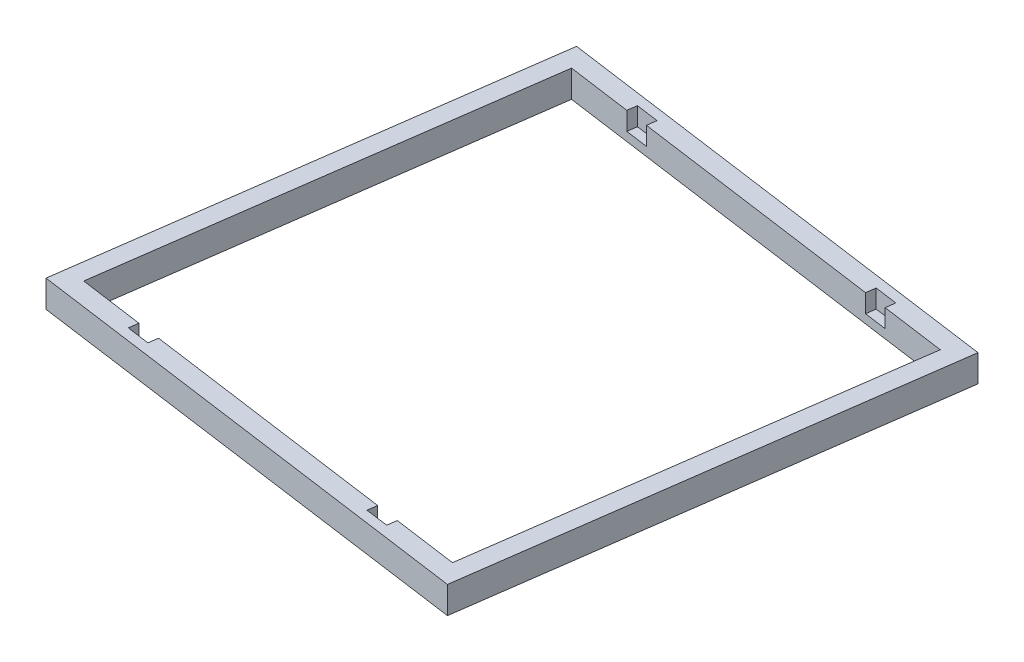
ISO-10303-21;
HEADER;
FILE_DESCRIPTION(('STEP AP214'),'2;1');
FILE_NAME('part.step','',(''),(''),'','','');
FILE_SCHEMA(('AUTOMOTIVE_DESIGN { 1 0 10303 214 1 1 1 1 }'));
ENDSEC;
DATA;
#1=APPLICATION_CONTEXT('core data for automotive mechanical design processes');
#2=APPLICATION_PROTOCOL_DEFINITION('international standard','automotive_design',2000,#1);
#3=PRODUCT_CONTEXT('',#1,'mechanical');
#4=PRODUCT('Part','Part','',(#3));
#5=PRODUCT_RELATED_PRODUCT_CATEGORY('part','',(#4));
#6=PRODUCT_DEFINITION_FORMATION('','',#4);
#7=PRODUCT_DEFINITION_CONTEXT('part definition',#1,'design');
#8=PRODUCT_DEFINITION('design','',#6,#7);
#9=PRODUCT_DEFINITION_SHAPE('','',#8);
#10=(LENGTH_UNIT() NAMED_UNIT(*) SI_UNIT(.MILLI.,.METRE.));
#11=(NAMED_UNIT(*) PLANE_ANGLE_UNIT() SI_UNIT($,.RADIAN.));
#12=(NAMED_UNIT(*) SI_UNIT($,.STERADIAN.) SOLID_ANGLE_UNIT());
#13=UNCERTAINTY_MEASURE_WITH_UNIT(LENGTH_MEASURE(1.E-05),#10,'distance_accuracy_value','');
#14=(GEOMETRIC_REPRESENTATION_CONTEXT(3) GLOBAL_UNCERTAINTY_ASSIGNED_CONTEXT((#13)) GLOBAL_UNIT_ASSIGNED_CONTEXT((#10,
#11,#12)) REPRESENTATION_CONTEXT('',''));
#15=CARTESIAN_POINT('',(0.,0.,0.));
#16=DIRECTION('',(0.,0.,1.));
#17=DIRECTION('',(1.,0.,0.));
#18=AXIS2_PLACEMENT_3D('',#15,#16,#17);
#19=CARTESIAN_POINT('',(0.,5.08,0.));
#20=DIRECTION('',(0.,1.,0.));
#21=DIRECTION('',(0.,0.,1.));
#22=AXIS2_PLACEMENT_3D('',#19,#20,#21);
#23=PLANE('',#22);
#24=DIRECTION('',(0.137667557047881,0.,-0.990478492313926));
#25=VECTOR('',#24,1.);
#26=CARTESIAN_POINT('',(-92.7077964020911,5.08,-12.8855456721246));
#27=LINE('',#26,#25);
#28=CARTESIAN_POINT('',(-96.340320285637,5.08,13.2494192871031));
#29=VERTEX_POINT('',#28);
#30=CARTESIAN_POINT('',(-96.0955473692058,5.08,11.4883485277689));
#31=VERTEX_POINT('',#30);
#32=EDGE_CURVE('E224',#29,#31,#27,.T.);
#33=ORIENTED_EDGE('',*,*,#32,.F.);
#34=DIRECTION('',(-0.990478492313926,0.,-0.137667557047881));
#35=VECTOR('',#34,1.);
#36=CARTESIAN_POINT('',(-3.63252388354589,5.08,26.1349649592277));
#37=LINE('',#36,#35);
#38=CARTESIAN_POINT('',(-100.617206415449,5.08,12.6549707757703));
#39=VERTEX_POINT('',#38);
#40=EDGE_CURVE('E11',#29,#39,#37,.T.);
#41=ORIENTED_EDGE('',*,*,#40,.T.);
#42=DIRECTION('',(-0.137667557047881,0.,0.990478492313926));
#43=VECTOR('',#42,1.);
#44=CARTESIAN_POINT('',(-96.9846825319028,5.08,-13.4799941834574));
#45=LINE('',#44,#43);
#46=CARTESIAN_POINT('',(-100.372433499018,5.08,10.8939000164362));
#47=VERTEX_POINT('',#46);
#48=EDGE_CURVE('E221',#47,#39,#45,.T.);
#49=ORIENTED_EDGE('',*,*,#48,.F.);
#50=DIRECTION('',(0.990478492313926,0.,0.137667557047881));
#51=VECTOR('',#50,1.);
#52=CARTESIAN_POINT('',(-112.425108514948,5.08,9.21868713881081));
#53=LINE('',#52,#51);
#54=CARTESIAN_POINT('',(-112.425108514948,5.08,9.21868713881082));
#55=VERTEX_POINT('',#54);
#56=EDGE_CURVE('E304',#55,#47,#53,.T.);
#57=ORIENTED_EDGE('',*,*,#56,.F.);
#58=DIRECTION('',(-0.137667557047881,0.,0.990478492313926));
#59=VECTOR('',#58,1.);
#60=CARTESIAN_POINT('',(-101.244917101907,5.08,-71.2195756736735));
#61=LINE('',#60,#59);
#62=CARTESIAN_POINT('',(-101.244917101907,5.08,-71.2195756736735));
#63=VERTEX_POINT('',#62);
#64=EDGE_CURVE('E299',#63,#55,#61,.T.);
#65=ORIENTED_EDGE('',*,*,#64,.F.);
#66=DIRECTION('',(-0.990478492313926,0.,-0.137667557047882));
#67=VECTOR('',#66,1.);
#68=CARTESIAN_POINT('',(-20.8066542894228,5.08,-60.0393842606323));
#69=LINE('',#68,#67);
#70=CARTESIAN_POINT('',(-89.1922420859762,5.08,-69.5443627960482));
#71=VERTEX_POINT('',#70);
#72=EDGE_CURVE('E294',#71,#63,#69,.T.);
#73=ORIENTED_EDGE('',*,*,#72,.F.);
#74=DIRECTION('',(-0.137667557047882,0.,0.990478492313926));
#75=VECTOR('',#74,1.);
#76=CARTESIAN_POINT('',(-96.9846825319027,5.08,-13.4799941834574));
#77=LINE('',#76,#75);
#78=CARTESIAN_POINT('',(-88.9474691695451,5.08,-71.3054335553824));
#79=VERTEX_POINT('',#78);
#80=EDGE_CURVE('E58',#79,#71,#77,.T.);
#81=ORIENTED_EDGE('',*,*,#80,.F.);
#82=DIRECTION('',(0.990478492313926,0.,0.137667557047881));
#83=VECTOR('',#82,1.);
#84=CARTESIAN_POINT('',(8.03721336235755,5.08,-57.825439371925));
#85=LINE('',#84,#83);
#86=CARTESIAN_POINT('',(-84.6705830397335,5.08,-70.7109850440496));
#87=VERTEX_POINT('',#86);
#88=EDGE_CURVE('E371',#79,#87,#85,.T.);
#89=ORIENTED_EDGE('',*,*,#88,.T.);
#90=DIRECTION('',(0.137667557047882,0.,-0.990478492313926));
#91=VECTOR('',#90,1.);
#92=CARTESIAN_POINT('',(-92.7077964020911,5.08,-12.8855456721247));
#93=LINE('',#92,#91);
#94=CARTESIAN_POINT('',(-84.9153559561647,5.08,-68.9499142847154));
#95=VERTEX_POINT('',#94);
#96=EDGE_CURVE('E245',#95,#87,#93,.T.);
#97=ORIENTED_EDGE('',*,*,#96,.F.);
#98=CARTESIAN_POINT('',(-37.1148639170946,5.08,-62.3060779815847));
#99=VERTEX_POINT('',#98);
#100=EDGE_CURVE('E300',#99,#95,#69,.T.);
#101=ORIENTED_EDGE('',*,*,#100,.F.);
#102=DIRECTION('',(-0.137667557047882,0.,0.990478492313926));
#103=VECTOR('',#102,1.);
#104=CARTESIAN_POINT('',(-44.9073043630211,5.08,-6.24170936899391));
#105=LINE('',#104,#103);
#106=CARTESIAN_POINT('',(-36.8700910006635,5.08,-64.0671487409188));
#107=VERTEX_POINT('',#106);
#108=EDGE_CURVE('E263',#107,#99,#105,.T.);
#109=ORIENTED_EDGE('',*,*,#108,.F.);
#110=DIRECTION('',(0.990478492313926,0.,0.137667557047881));
#111=VECTOR('',#110,1.);
#112=CARTESIAN_POINT('',(8.03721336235759,5.08,-57.8254393719249));
#113=LINE('',#112,#111);
#114=CARTESIAN_POINT('',(-32.5932048708519,5.08,-63.4727002295861));
#115=VERTEX_POINT('',#114);
#116=EDGE_CURVE('E366',#107,#115,#113,.T.);
#117=ORIENTED_EDGE('',*,*,#116,.T.);
#118=DIRECTION('',(0.137667557047882,0.,-0.990478492313926));
#119=VECTOR('',#118,1.);
#120=CARTESIAN_POINT('',(-40.6304182332096,5.08,-5.64726085766115));
#121=LINE('',#120,#119);
#122=CARTESIAN_POINT('',(-32.8379777872831,5.08,-61.7116294702519));
#123=VERTEX_POINT('',#122);
#124=EDGE_CURVE('E267',#123,#115,#121,.T.);
#125=ORIENTED_EDGE('',*,*,#124,.F.);
#126=CARTESIAN_POINT('',(-20.8066542894228,5.08,-60.0393842606323));
#127=VERTEX_POINT('',#126);
#128=EDGE_CURVE('E296',#127,#123,#69,.T.);
#129=ORIENTED_EDGE('',*,*,#128,.F.);
#130=DIRECTION('',(0.137667557047881,0.,-0.990478492313926));
#131=VECTOR('',#130,1.);
#132=CARTESIAN_POINT('',(-31.986845702464,5.08,20.398878551852));
#133=LINE('',#132,#131);
#134=CARTESIAN_POINT('',(-31.986845702464,5.08,20.398878551852));
#135=VERTEX_POINT('',#134);
#136=EDGE_CURVE('E292',#135,#127,#133,.T.);
#137=ORIENTED_EDGE('',*,*,#136,.F.);
#138=CARTESIAN_POINT('',(-44.0181692003243,5.08,18.7266333422324));
#139=VERTEX_POINT('',#138);
#140=EDGE_CURVE('E303',#139,#135,#53,.T.);
#141=ORIENTED_EDGE('',*,*,#140,.F.);
#142=DIRECTION('',(0.137667557047881,0.,-0.990478492313926));
#143=VECTOR('',#142,1.);
#144=CARTESIAN_POINT('',(-40.6304182332096,5.08,-5.64726085766114));
#145=LINE('',#144,#143);
#146=CARTESIAN_POINT('',(-44.2629421167555,5.08,20.4877041015666));
#147=VERTEX_POINT('',#146);
#148=EDGE_CURVE('E289',#147,#139,#145,.T.);
#149=ORIENTED_EDGE('',*,*,#148,.F.);
#150=DIRECTION('',(-0.990478492313926,0.,-0.137667557047881));
#151=VECTOR('',#150,1.);
#152=CARTESIAN_POINT('',(-3.63252388354589,5.08,26.1349649592277));
#153=LINE('',#152,#151);
#154=CARTESIAN_POINT('',(-48.539828246567,5.08,19.8932555902338));
#155=VERTEX_POINT('',#154);
#156=EDGE_CURVE('E361',#147,#155,#153,.T.);
#157=ORIENTED_EDGE('',*,*,#156,.T.);
#158=DIRECTION('',(-0.137667557047881,0.,0.990478492313926));
#159=VECTOR('',#158,1.);
#160=CARTESIAN_POINT('',(-44.9073043630211,5.08,-6.24170936899389));
#161=LINE('',#160,#159);
#162=CARTESIAN_POINT('',(-48.2950553301359,5.08,18.1321848308997));
#163=VERTEX_POINT('',#162);
#164=EDGE_CURVE('E286',#163,#155,#161,.T.);
#165=ORIENTED_EDGE('',*,*,#164,.F.);
#166=EDGE_CURVE('E308',#31,#163,#53,.T.);
#167=ORIENTED_EDGE('',*,*,#166,.F.);
#168=EDGE_LOOP('',(#33,#41,#49,#57,#65,#73,#81,#89,#97,#101,#109,#117,#125,#129,#137,#141,#149,
#157,#165,#167));
#169=FACE_BOUND('',#168,.T.);
#170=DIRECTION('',(0.990538086436754,0.,0.137238111755494));
#171=VECTOR('',#170,1.);
#172=CARTESIAN_POINT('',(-116.440036471431,5.08,12.2876896910503));
#173=LINE('',#172,#171);
#174=CARTESIAN_POINT('',(-116.440036471431,5.08,12.2876896910503));
#175=VERTEX_POINT('',#174);
#176=CARTESIAN_POINT('',(-28.9178431502251,5.08,24.4138065083348));
#177=VERTEX_POINT('',#176);
#178=EDGE_CURVE('E329',#175,#177,#173,.T.);
#179=ORIENTED_EDGE('',*,*,#178,.T.);
#180=DIRECTION('',(0.137238111755497,0.,-0.990538086436754));
#181=VECTOR('',#180,1.);
#182=CARTESIAN_POINT('',(-28.9178431502251,5.08,24.4138065083348));
#183=LINE('',#182,#181);
#184=CARTESIAN_POINT('',(-16.7917263329401,5.08,-63.1083868128714));
#185=VERTEX_POINT('',#184);
#186=EDGE_CURVE('E332',#177,#185,#183,.T.);
#187=ORIENTED_EDGE('',*,*,#186,.T.);
#188=DIRECTION('',(-0.990538086436754,0.,-0.137238111755494));
#189=VECTOR('',#188,1.);
#190=CARTESIAN_POINT('',(-16.7917263329401,5.08,-63.1083868128714));
#191=LINE('',#190,#189);
#192=CARTESIAN_POINT('',(-104.313919654146,5.08,-75.234503630156));
#193=VERTEX_POINT('',#192);
#194=EDGE_CURVE('E335',#185,#193,#191,.T.);
#195=ORIENTED_EDGE('',*,*,#194,.T.);
#196=DIRECTION('',(-0.137238111755494,0.,0.990538086436754));
#197=VECTOR('',#196,1.);
#198=CARTESIAN_POINT('',(-104.313919654146,5.08,-75.234503630156));
#199=LINE('',#198,#197);
#200=EDGE_CURVE('E337',#193,#175,#199,.T.);
#201=ORIENTED_EDGE('',*,*,#200,.T.);
#202=EDGE_LOOP('',(#179,#187,#195,#201));
#203=FACE_BOUND('',#202,.T.);
#204=ADVANCED_FACE('F35',(#169,#203),#23,.T.);
#205=CARTESIAN_POINT('',(0.,0.,0.));
#206=DIRECTION('',(0.,1.,0.));
#207=DIRECTION('',(0.,0.,1.));
#208=AXIS2_PLACEMENT_3D('',#205,#206,#207);
#209=PLANE('',#208);
#210=DIRECTION('',(0.990538086436754,0.,0.137238111755494));
#211=VECTOR('',#210,1.);
#212=CARTESIAN_POINT('',(-116.440036471431,0.,12.2876896910503));
#213=LINE('',#212,#211);
#214=CARTESIAN_POINT('',(-116.440036471431,0.,12.2876896910503));
#215=VERTEX_POINT('',#214);
#216=CARTESIAN_POINT('',(-28.9178431502251,0.,24.4138065083348));
#217=VERTEX_POINT('',#216);
#218=EDGE_CURVE('E328',#215,#217,#213,.T.);
#219=ORIENTED_EDGE('',*,*,#218,.F.);
#220=DIRECTION('',(-0.137238111755494,0.,0.990538086436754));
#221=VECTOR('',#220,1.);
#222=CARTESIAN_POINT('',(-104.313919654146,0.,-75.234503630156));
#223=LINE('',#222,#221);
#224=CARTESIAN_POINT('',(-104.313919654146,0.,-75.234503630156));
#225=VERTEX_POINT('',#224);
#226=EDGE_CURVE('E333',#225,#215,#223,.T.);
#227=ORIENTED_EDGE('',*,*,#226,.F.);
#228=DIRECTION('',(-0.990538086436754,0.,-0.137238111755494));
#229=VECTOR('',#228,1.);
#230=CARTESIAN_POINT('',(-16.7917263329401,0.,-63.1083868128714));
#231=LINE('',#230,#229);
#232=CARTESIAN_POINT('',(-16.7917263329401,0.,-63.1083868128714));
#233=VERTEX_POINT('',#232);
#234=EDGE_CURVE('E344',#233,#225,#231,.T.);
#235=ORIENTED_EDGE('',*,*,#234,.F.);
#236=DIRECTION('',(0.137238111755497,0.,-0.990538086436754));
#237=VECTOR('',#236,1.);
#238=CARTESIAN_POINT('',(-28.9178431502251,0.,24.4138065083348));
#239=LINE('',#238,#237);
#240=EDGE_CURVE('E342',#217,#233,#239,.T.);
#241=ORIENTED_EDGE('',*,*,#240,.F.);
#242=EDGE_LOOP('',(#219,#227,#235,#241));
#243=FACE_BOUND('',#242,.T.);
#244=DIRECTION('',(0.137667557047881,0.,-0.990478492313926));
#245=VECTOR('',#244,1.);
#246=CARTESIAN_POINT('',(-31.986845702464,0.,20.398878551852));
#247=LINE('',#246,#245);
#248=CARTESIAN_POINT('',(-31.986845702464,0.,20.398878551852));
#249=VERTEX_POINT('',#248);
#250=CARTESIAN_POINT('',(-20.8066542894228,0.,-60.0393842606323));
#251=VERTEX_POINT('',#250);
#252=EDGE_CURVE('E291',#249,#251,#247,.T.);
#253=ORIENTED_EDGE('',*,*,#252,.T.);
#254=DIRECTION('',(-0.990478492313926,0.,-0.137667557047882));
#255=VECTOR('',#254,1.);
#256=CARTESIAN_POINT('',(-20.8066542894228,0.,-60.0393842606323));
#257=LINE('',#256,#255);
#258=CARTESIAN_POINT('',(-101.244917101907,0.,-71.2195756736735));
#259=VERTEX_POINT('',#258);
#260=EDGE_CURVE('E311',#251,#259,#257,.T.);
#261=ORIENTED_EDGE('',*,*,#260,.T.);
#262=DIRECTION('',(-0.137667557047881,0.,0.990478492313926));
#263=VECTOR('',#262,1.);
#264=CARTESIAN_POINT('',(-101.244917101907,0.,-71.2195756736735));
#265=LINE('',#264,#263);
#266=CARTESIAN_POINT('',(-112.425108514948,0.,9.21868713881081));
#267=VERTEX_POINT('',#266);
#268=EDGE_CURVE('E314',#259,#267,#265,.T.);
#269=ORIENTED_EDGE('',*,*,#268,.T.);
#270=DIRECTION('',(0.990478492313926,0.,0.137667557047881));
#271=VECTOR('',#270,1.);
#272=CARTESIAN_POINT('',(-112.425108514948,0.,9.21868713881081));
#273=LINE('',#272,#271);
#274=EDGE_CURVE('E295',#267,#249,#273,.T.);
#275=ORIENTED_EDGE('',*,*,#274,.T.);
#276=EDGE_LOOP('',(#253,#261,#269,#275));
#277=FACE_BOUND('',#276,.T.);
#278=ADVANCED_FACE('F409',(#243,#277),#209,.F.);
#279=CARTESIAN_POINT('',(-116.440036471431,5.08,12.2876896910503));
#280=DIRECTION('',(0.137238111755494,0.,-0.990538086436754));
#281=DIRECTION('',(-0.990538086436754,0.,-0.137238111755494));
#282=AXIS2_PLACEMENT_3D('',#279,#280,#281);
#283=PLANE('',#282);
#284=ORIENTED_EDGE('',*,*,#218,.T.);
#285=DIRECTION('',(0.,-1.,0.));
#286=VECTOR('',#285,1.);
#287=CARTESIAN_POINT('',(-28.9178431502251,5.08,24.4138065083348));
#288=LINE('',#287,#286);
#289=EDGE_CURVE('E355',#177,#217,#288,.T.);
#290=ORIENTED_EDGE('',*,*,#289,.F.);
#291=ORIENTED_EDGE('',*,*,#178,.F.);
#292=DIRECTION('',(0.,-1.,0.));
#293=VECTOR('',#292,1.);
#294=CARTESIAN_POINT('',(-116.440036471431,5.08,12.2876896910503));
#295=LINE('',#294,#293);
#296=EDGE_CURVE('E339',#175,#215,#295,.T.);
#297=ORIENTED_EDGE('',*,*,#296,.T.);
#298=EDGE_LOOP('',(#284,#290,#291,#297));
#299=FACE_BOUND('',#298,.T.);
#300=ADVANCED_FACE('F37',(#299),#283,.F.);
#301=CARTESIAN_POINT('',(-28.9178431502251,5.08,24.4138065083348));
#302=DIRECTION('',(-0.990538086436754,0.,-0.137238111755497));
#303=DIRECTION('',(-0.137238111755497,0.,0.990538086436754));
#304=AXIS2_PLACEMENT_3D('',#301,#302,#303);
#305=PLANE('',#304);
#306=ORIENTED_EDGE('',*,*,#240,.T.);
#307=DIRECTION('',(0.,-1.,0.));
#308=VECTOR('',#307,1.);
#309=CARTESIAN_POINT('',(-16.7917263329401,5.08,-63.1083868128714));
#310=LINE('',#309,#308);
#311=EDGE_CURVE('E352',#185,#233,#310,.T.);
#312=ORIENTED_EDGE('',*,*,#311,.F.);
#313=ORIENTED_EDGE('',*,*,#186,.F.);
#314=ORIENTED_EDGE('',*,*,#289,.T.);
#315=EDGE_LOOP('',(#306,#312,#313,#314));
#316=FACE_BOUND('',#315,.T.);
#317=ADVANCED_FACE('F456',(#316),#305,.F.);
#318=CARTESIAN_POINT('',(-16.7917263329401,5.08,-63.1083868128714));
#319=DIRECTION('',(-0.137238111755494,0.,0.990538086436754));
#320=DIRECTION('',(0.990538086436754,0.,0.137238111755494));
#321=AXIS2_PLACEMENT_3D('',#318,#319,#320);
#322=PLANE('',#321);
#323=ORIENTED_EDGE('',*,*,#234,.T.);
#324=DIRECTION('',(0.,-1.,0.));
#325=VECTOR('',#324,1.);
#326=CARTESIAN_POINT('',(-104.313919654146,5.08,-75.234503630156));
#327=LINE('',#326,#325);
#328=EDGE_CURVE('E349',#193,#225,#327,.T.);
#329=ORIENTED_EDGE('',*,*,#328,.F.);
#330=ORIENTED_EDGE('',*,*,#194,.F.);
#331=ORIENTED_EDGE('',*,*,#311,.T.);
#332=EDGE_LOOP('',(#323,#329,#330,#331));
#333=FACE_BOUND('',#332,.T.);
#334=ADVANCED_FACE('F453',(#333),#322,.F.);
#335=CARTESIAN_POINT('',(-104.313919654146,5.08,-75.234503630156));
#336=DIRECTION('',(0.990538086436754,0.,0.137238111755494));
#337=DIRECTION('',(0.137238111755494,0.,-0.990538086436754));
#338=AXIS2_PLACEMENT_3D('',#335,#336,#337);
#339=PLANE('',#338);
#340=ORIENTED_EDGE('',*,*,#226,.T.);
#341=ORIENTED_EDGE('',*,*,#296,.F.);
#342=ORIENTED_EDGE('',*,*,#200,.F.);
#343=ORIENTED_EDGE('',*,*,#328,.T.);
#344=EDGE_LOOP('',(#340,#341,#342,#343));
#345=FACE_BOUND('',#344,.T.);
#346=ADVANCED_FACE('F450',(#345),#339,.F.);
#347=CARTESIAN_POINT('',(-31.986845702464,5.08,20.398878551852));
#348=DIRECTION('',(-0.990478492313926,0.,-0.137667557047881));
#349=DIRECTION('',(-0.137667557047881,0.,0.990478492313926));
#350=AXIS2_PLACEMENT_3D('',#347,#348,#349);
#351=PLANE('',#350);
#352=ORIENTED_EDGE('',*,*,#252,.F.);
#353=DIRECTION('',(0.,-1.,0.));
#354=VECTOR('',#353,1.);
#355=CARTESIAN_POINT('',(-31.986845702464,5.08,20.398878551852));
#356=LINE('',#355,#354);
#357=EDGE_CURVE('E307',#135,#249,#356,.T.);
#358=ORIENTED_EDGE('',*,*,#357,.F.);
#359=ORIENTED_EDGE('',*,*,#136,.T.);
#360=DIRECTION('',(0.,-1.,0.));
#361=VECTOR('',#360,1.);
#362=CARTESIAN_POINT('',(-20.8066542894228,5.08,-60.0393842606323));
#363=LINE('',#362,#361);
#364=EDGE_CURVE('E325',#127,#251,#363,.T.);
#365=ORIENTED_EDGE('',*,*,#364,.T.);
#366=EDGE_LOOP('',(#352,#358,#359,#365));
#367=FACE_BOUND('',#366,.T.);
#368=ADVANCED_FACE('F413',(#367),#351,.T.);
#369=CARTESIAN_POINT('',(-20.8066542894228,5.08,-60.0393842606323));
#370=DIRECTION('',(-0.137667557047882,0.,0.990478492313926));
#371=DIRECTION('',(0.990478492313926,0.,0.137667557047882));
#372=AXIS2_PLACEMENT_3D('',#369,#370,#371);
#373=PLANE('',#372);
#374=DIRECTION('',(0.,1.,0.));
#375=VECTOR('',#374,1.);
#376=CARTESIAN_POINT('',(-84.9153559561647,1.651,-68.9499142847154));
#377=LINE('',#376,#375);
#378=CARTESIAN_POINT('',(-84.9153559561647,1.651,-68.9499142847154));
#379=VERTEX_POINT('',#378);
#380=EDGE_CURVE('E226',#379,#95,#377,.T.);
#381=ORIENTED_EDGE('',*,*,#380,.F.);
#382=DIRECTION('',(0.990478492313926,0.,0.137667557047881));
#383=VECTOR('',#382,1.);
#384=CARTESIAN_POINT('',(-89.1922420859762,1.651,-69.5443627960482));
#385=LINE('',#384,#383);
#386=CARTESIAN_POINT('',(-89.1922420859762,1.651,-69.5443627960482));
#387=VERTEX_POINT('',#386);
#388=EDGE_CURVE('E231',#387,#379,#385,.T.);
#389=ORIENTED_EDGE('',*,*,#388,.F.);
#390=DIRECTION('',(0.,-1.,0.));
#391=VECTOR('',#390,1.);
#392=CARTESIAN_POINT('',(-89.1922420859763,5.08,-69.5443627960482));
#393=LINE('',#392,#391);
#394=EDGE_CURVE('E369',#71,#387,#393,.T.);
#395=ORIENTED_EDGE('',*,*,#394,.F.);
#396=ORIENTED_EDGE('',*,*,#72,.T.);
#397=DIRECTION('',(0.,-1.,0.));
#398=VECTOR('',#397,1.);
#399=CARTESIAN_POINT('',(-101.244917101907,5.08,-71.2195756736735));
#400=LINE('',#399,#398);
#401=EDGE_CURVE('E323',#63,#259,#400,.T.);
#402=ORIENTED_EDGE('',*,*,#401,.T.);
#403=ORIENTED_EDGE('',*,*,#260,.F.);
#404=ORIENTED_EDGE('',*,*,#364,.F.);
#405=ORIENTED_EDGE('',*,*,#128,.T.);
#406=DIRECTION('',(0.,1.,0.));
#407=VECTOR('',#406,1.);
#408=CARTESIAN_POINT('',(-32.8379777872831,1.651,-61.7116294702519));
#409=LINE('',#408,#407);
#410=CARTESIAN_POINT('',(-32.8379777872831,1.651,-61.7116294702519));
#411=VERTEX_POINT('',#410);
#412=EDGE_CURVE('E247',#411,#123,#409,.T.);
#413=ORIENTED_EDGE('',*,*,#412,.F.);
#414=DIRECTION('',(0.990478492313926,0.,0.137667557047881));
#415=VECTOR('',#414,1.);
#416=CARTESIAN_POINT('',(-37.1148639170946,1.651,-62.3060779815847));
#417=LINE('',#416,#415);
#418=CARTESIAN_POINT('',(-37.1148639170946,1.651,-62.3060779815847));
#419=VERTEX_POINT('',#418);
#420=EDGE_CURVE('E252',#419,#411,#417,.T.);
#421=ORIENTED_EDGE('',*,*,#420,.F.);
#422=DIRECTION('',(0.,-1.,0.));
#423=VECTOR('',#422,1.);
#424=CARTESIAN_POINT('',(-37.1148639170946,5.08,-62.3060779815847));
#425=LINE('',#424,#423);
#426=EDGE_CURVE('E364',#99,#419,#425,.T.);
#427=ORIENTED_EDGE('',*,*,#426,.F.);
#428=ORIENTED_EDGE('',*,*,#100,.T.);
#429=EDGE_LOOP('',(#381,#389,#395,#396,#402,#403,#404,#405,#413,#421,#427,#428));
#430=FACE_BOUND('',#429,.T.);
#431=ADVANCED_FACE('F392',(#430),#373,.T.);
#432=CARTESIAN_POINT('',(-101.244917101907,5.08,-71.2195756736735));
#433=DIRECTION('',(0.990478492313926,0.,0.137667557047881));
#434=DIRECTION('',(0.137667557047881,0.,-0.990478492313926));
#435=AXIS2_PLACEMENT_3D('',#432,#433,#434);
#436=PLANE('',#435);
#437=ORIENTED_EDGE('',*,*,#268,.F.);
#438=ORIENTED_EDGE('',*,*,#401,.F.);
#439=ORIENTED_EDGE('',*,*,#64,.T.);
#440=DIRECTION('',(0.,-1.,0.));
#441=VECTOR('',#440,1.);
#442=CARTESIAN_POINT('',(-112.425108514948,5.08,9.21868713881081));
#443=LINE('',#442,#441);
#444=EDGE_CURVE('E321',#55,#267,#443,.T.);
#445=ORIENTED_EDGE('',*,*,#444,.T.);
#446=EDGE_LOOP('',(#437,#438,#439,#445));
#447=FACE_BOUND('',#446,.T.);
#448=ADVANCED_FACE('F400',(#447),#436,.T.);
#449=CARTESIAN_POINT('',(-112.425108514948,5.08,9.21868713881081));
#450=DIRECTION('',(0.137667557047881,0.,-0.990478492313926));
#451=DIRECTION('',(-0.990478492313926,0.,-0.137667557047881));
#452=AXIS2_PLACEMENT_3D('',#449,#450,#451);
#453=PLANE('',#452);
#454=DIRECTION('',(0.,-1.,0.));
#455=VECTOR('',#454,1.);
#456=CARTESIAN_POINT('',(-96.0955473692058,5.08,11.4883485277689));
#457=LINE('',#456,#455);
#458=CARTESIAN_POINT('',(-96.0955473692058,1.65099999999992,11.4883485277689));
#459=VERTEX_POINT('',#458);
#460=EDGE_CURVE('E43',#31,#459,#457,.T.);
#461=ORIENTED_EDGE('',*,*,#460,.F.);
#462=ORIENTED_EDGE('',*,*,#166,.T.);
#463=DIRECTION('',(0.,1.,0.));
#464=VECTOR('',#463,1.);
#465=CARTESIAN_POINT('',(-48.2950553301359,1.651,18.1321848308997));
#466=LINE('',#465,#464);
#467=CARTESIAN_POINT('',(-48.2950553301359,1.651,18.1321848308997));
#468=VERTEX_POINT('',#467);
#469=EDGE_CURVE('E273',#468,#163,#466,.T.);
#470=ORIENTED_EDGE('',*,*,#469,.F.);
#471=DIRECTION('',(-0.990478492313926,0.,-0.137667557047881));
#472=VECTOR('',#471,1.);
#473=CARTESIAN_POINT('',(-44.0181692003243,1.651,18.7266333422324));
#474=LINE('',#473,#472);
#475=CARTESIAN_POINT('',(-44.0181692003243,1.651,18.7266333422324));
#476=VERTEX_POINT('',#475);
#477=EDGE_CURVE('E269',#476,#468,#474,.T.);
#478=ORIENTED_EDGE('',*,*,#477,.F.);
#479=DIRECTION('',(0.,-1.,0.));
#480=VECTOR('',#479,1.);
#481=CARTESIAN_POINT('',(-44.0181692003243,5.08,18.7266333422324));
#482=LINE('',#481,#480);
#483=EDGE_CURVE('E358',#139,#476,#482,.T.);
#484=ORIENTED_EDGE('',*,*,#483,.F.);
#485=ORIENTED_EDGE('',*,*,#140,.T.);
#486=ORIENTED_EDGE('',*,*,#357,.T.);
#487=ORIENTED_EDGE('',*,*,#274,.F.);
#488=ORIENTED_EDGE('',*,*,#444,.F.);
#489=ORIENTED_EDGE('',*,*,#56,.T.);
#490=DIRECTION('',(0.,1.,0.));
#491=VECTOR('',#490,1.);
#492=CARTESIAN_POINT('',(-100.372433499018,1.65099999999992,10.8939000164362));
#493=LINE('',#492,#491);
#494=CARTESIAN_POINT('',(-100.372433499018,1.65099999999992,10.8939000164362));
#495=VERTEX_POINT('',#494);
#496=EDGE_CURVE('E205',#495,#47,#493,.T.);
#497=ORIENTED_EDGE('',*,*,#496,.F.);
#498=DIRECTION('',(-0.990478492313926,0.,-0.137667557047881));
#499=VECTOR('',#498,1.);
#500=CARTESIAN_POINT('',(-96.0955473692058,1.65099999999992,11.4883485277689));
#501=LINE('',#500,#499);
#502=EDGE_CURVE('E218',#459,#495,#501,.T.);
#503=ORIENTED_EDGE('',*,*,#502,.F.);
#504=EDGE_LOOP('',(#461,#462,#470,#478,#484,#485,#486,#487,#488,#489,#497,#503));
#505=FACE_BOUND('',#504,.T.);
#506=ADVANCED_FACE('F405',(#505),#453,.T.);
#507=CARTESIAN_POINT('',(-44.2629421167555,5.969,20.4877041015666));
#508=DIRECTION('',(0.990478492313926,0.,0.137667557047881));
#509=DIRECTION('',(0.137667557047881,0.,-0.990478492313926));
#510=AXIS2_PLACEMENT_3D('',#507,#508,#509);
#511=PLANE('',#510);
#512=ORIENTED_EDGE('',*,*,#148,.T.);
#513=ORIENTED_EDGE('',*,*,#483,.T.);
#514=DIRECTION('',(0.137667557047881,0.,-0.990478492313926));
#515=VECTOR('',#514,1.);
#516=CARTESIAN_POINT('',(-44.2629421167555,1.651,20.4877041015666));
#517=LINE('',#516,#515);
#518=CARTESIAN_POINT('',(-44.2629421167555,1.651,20.4877041015666));
#519=VERTEX_POINT('',#518);
#520=EDGE_CURVE('E279',#519,#476,#517,.T.);
#521=ORIENTED_EDGE('',*,*,#520,.F.);
#522=DIRECTION('',(0.,-1.,0.));
#523=VECTOR('',#522,1.);
#524=CARTESIAN_POINT('',(-44.2629421167555,5.969,20.4877041015666));
#525=LINE('',#524,#523);
#526=EDGE_CURVE('E270',#147,#519,#525,.T.);
#527=ORIENTED_EDGE('',*,*,#526,.F.);
#528=EDGE_LOOP('',(#512,#513,#521,#527));
#529=FACE_BOUND('',#528,.T.);
#530=ADVANCED_FACE('F504',(#529),#511,.F.);
#531=CARTESIAN_POINT('',(-48.539828246567,1.651,19.8932555902338));
#532=DIRECTION('',(-0.990478492313926,0.,-0.137667557047881));
#533=DIRECTION('',(-0.137667557047881,0.,0.990478492313926));
#534=AXIS2_PLACEMENT_3D('',#531,#532,#533);
#535=PLANE('',#534);
#536=ORIENTED_EDGE('',*,*,#164,.T.);
#537=DIRECTION('',(0.,1.,0.));
#538=VECTOR('',#537,1.);
#539=CARTESIAN_POINT('',(-48.539828246567,1.651,19.8932555902338));
#540=LINE('',#539,#538);
#541=CARTESIAN_POINT('',(-48.539828246567,1.651,19.8932555902338));
#542=VERTEX_POINT('',#541);
#543=EDGE_CURVE('E276',#542,#155,#540,.T.);
#544=ORIENTED_EDGE('',*,*,#543,.F.);
#545=DIRECTION('',(0.137667557047881,0.,-0.990478492313926));
#546=VECTOR('',#545,1.);
#547=CARTESIAN_POINT('',(-48.539828246567,1.651,19.8932555902338));
#548=LINE('',#547,#546);
#549=EDGE_CURVE('E284',#542,#468,#548,.T.);
#550=ORIENTED_EDGE('',*,*,#549,.T.);
#551=ORIENTED_EDGE('',*,*,#469,.T.);
#552=EDGE_LOOP('',(#536,#544,#550,#551));
#553=FACE_BOUND('',#552,.T.);
#554=ADVANCED_FACE('F615',(#553),#535,.F.);
#555=CARTESIAN_POINT('',(-44.2629421167555,1.651,20.4877041015666));
#556=DIRECTION('',(0.,-1.,0.));
#557=DIRECTION('',(1.,0.,0.));
#558=AXIS2_PLACEMENT_3D('',#555,#556,#557);
#559=PLANE('',#558);
#560=ORIENTED_EDGE('',*,*,#477,.T.);
#561=ORIENTED_EDGE('',*,*,#549,.F.);
#562=DIRECTION('',(-0.990478492313926,0.,-0.137667557047881));
#563=VECTOR('',#562,1.);
#564=CARTESIAN_POINT('',(-44.2629421167555,1.651,20.4877041015666));
#565=LINE('',#564,#563);
#566=EDGE_CURVE('E272',#519,#542,#565,.T.);
#567=ORIENTED_EDGE('',*,*,#566,.F.);
#568=ORIENTED_EDGE('',*,*,#520,.T.);
#569=EDGE_LOOP('',(#560,#561,#567,#568));
#570=FACE_BOUND('',#569,.T.);
#571=ADVANCED_FACE('F605',(#570),#559,.F.);
#572=CARTESIAN_POINT('',(-3.63252388354589,0.,26.1349649592277));
#573=DIRECTION('',(0.137667557047881,0.,-0.990478492313926));
#574=DIRECTION('',(-0.990478492313926,0.,-0.137667557047881));
#575=AXIS2_PLACEMENT_3D('',#572,#573,#574);
#576=PLANE('',#575);
#577=ORIENTED_EDGE('',*,*,#526,.T.);
#578=ORIENTED_EDGE('',*,*,#566,.T.);
#579=ORIENTED_EDGE('',*,*,#543,.T.);
#580=ORIENTED_EDGE('',*,*,#156,.F.);
#581=EDGE_LOOP('',(#577,#578,#579,#580));
#582=FACE_BOUND('',#581,.T.);
#583=ADVANCED_FACE('F596',(#582),#576,.T.);
#584=CARTESIAN_POINT('',(-32.5932048708519,1.651,-63.4727002295861));
#585=DIRECTION('',(0.990478492313926,0.,0.137667557047882));
#586=DIRECTION('',(0.137667557047882,0.,-0.990478492313926));
#587=AXIS2_PLACEMENT_3D('',#584,#585,#586);
#588=PLANE('',#587);
#589=ORIENTED_EDGE('',*,*,#124,.T.);
#590=DIRECTION('',(0.,1.,0.));
#591=VECTOR('',#590,1.);
#592=CARTESIAN_POINT('',(-32.5932048708519,1.651,-63.4727002295861));
#593=LINE('',#592,#591);
#594=CARTESIAN_POINT('',(-32.5932048708519,1.651,-63.4727002295861));
#595=VERTEX_POINT('',#594);
#596=EDGE_CURVE('E248',#595,#115,#593,.T.);
#597=ORIENTED_EDGE('',*,*,#596,.F.);
#598=DIRECTION('',(-0.137667557047882,0.,0.990478492313926));
#599=VECTOR('',#598,1.);
#600=CARTESIAN_POINT('',(-32.5932048708519,1.651,-63.4727002295861));
#601=LINE('',#600,#599);
#602=EDGE_CURVE('E261',#595,#411,#601,.T.);
#603=ORIENTED_EDGE('',*,*,#602,.T.);
#604=ORIENTED_EDGE('',*,*,#412,.T.);
#605=EDGE_LOOP('',(#589,#597,#603,#604));
#606=FACE_BOUND('',#605,.T.);
#607=ADVANCED_FACE('F420',(#606),#588,.F.);
#608=CARTESIAN_POINT('',(-36.8700910006635,1.651,-64.0671487409188));
#609=DIRECTION('',(0.,-1.,0.));
#610=DIRECTION('',(0.,0.,-1.));
#611=AXIS2_PLACEMENT_3D('',#608,#609,#610);
#612=PLANE('',#611);
#613=ORIENTED_EDGE('',*,*,#420,.T.);
#614=ORIENTED_EDGE('',*,*,#602,.F.);
#615=DIRECTION('',(0.990478492313926,0.,0.137667557047881));
#616=VECTOR('',#615,1.);
#617=CARTESIAN_POINT('',(-36.8700910006635,1.651,-64.0671487409188));
#618=LINE('',#617,#616);
#619=CARTESIAN_POINT('',(-36.8700910006635,1.651,-64.0671487409188));
#620=VERTEX_POINT('',#619);
#621=EDGE_CURVE('E254',#620,#595,#618,.T.);
#622=ORIENTED_EDGE('',*,*,#621,.F.);
#623=DIRECTION('',(-0.137667557047882,0.,0.990478492313926));
#624=VECTOR('',#623,1.);
#625=CARTESIAN_POINT('',(-36.8700910006635,1.651,-64.0671487409188));
#626=LINE('',#625,#624);
#627=EDGE_CURVE('E257',#620,#419,#626,.T.);
#628=ORIENTED_EDGE('',*,*,#627,.T.);
#629=EDGE_LOOP('',(#613,#614,#622,#628));
#630=FACE_BOUND('',#629,.T.);
#631=ADVANCED_FACE('F424',(#630),#612,.F.);
#632=CARTESIAN_POINT('',(-36.8700910006635,5.969,-64.0671487409188));
#633=DIRECTION('',(-0.990478492313926,0.,-0.137667557047882));
#634=DIRECTION('',(-0.137667557047882,0.,0.990478492313926));
#635=AXIS2_PLACEMENT_3D('',#632,#633,#634);
#636=PLANE('',#635);
#637=ORIENTED_EDGE('',*,*,#108,.T.);
#638=ORIENTED_EDGE('',*,*,#426,.T.);
#639=ORIENTED_EDGE('',*,*,#627,.F.);
#640=DIRECTION('',(0.,-1.,0.));
#641=VECTOR('',#640,1.);
#642=CARTESIAN_POINT('',(-36.8700910006635,5.969,-64.0671487409188));
#643=LINE('',#642,#641);
#644=EDGE_CURVE('E251',#107,#620,#643,.T.);
#645=ORIENTED_EDGE('',*,*,#644,.F.);
#646=EDGE_LOOP('',(#637,#638,#639,#645));
#647=FACE_BOUND('',#646,.T.);
#648=ADVANCED_FACE('F428',(#647),#636,.F.);
#649=CARTESIAN_POINT('',(8.03721336235759,0.,-57.8254393719249));
#650=DIRECTION('',(-0.137667557047881,0.,0.990478492313926));
#651=DIRECTION('',(0.990478492313926,0.,0.137667557047881));
#652=AXIS2_PLACEMENT_3D('',#649,#650,#651);
#653=PLANE('',#652);
#654=ORIENTED_EDGE('',*,*,#644,.T.);
#655=ORIENTED_EDGE('',*,*,#621,.T.);
#656=ORIENTED_EDGE('',*,*,#596,.T.);
#657=ORIENTED_EDGE('',*,*,#116,.F.);
#658=EDGE_LOOP('',(#654,#655,#656,#657));
#659=FACE_BOUND('',#658,.T.);
#660=ADVANCED_FACE('F430',(#659),#653,.T.);
#661=CARTESIAN_POINT('',(-84.6705830397335,1.651,-70.7109850440496));
#662=DIRECTION('',(0.990478492313926,0.,0.137667557047882));
#663=DIRECTION('',(0.137667557047882,0.,-0.990478492313926));
#664=AXIS2_PLACEMENT_3D('',#661,#662,#663);
#665=PLANE('',#664);
#666=ORIENTED_EDGE('',*,*,#96,.T.);
#667=DIRECTION('',(0.,1.,0.));
#668=VECTOR('',#667,1.);
#669=CARTESIAN_POINT('',(-84.6705830397335,1.651,-70.7109850440496));
#670=LINE('',#669,#668);
#671=CARTESIAN_POINT('',(-84.6705830397335,1.651,-70.7109850440496));
#672=VERTEX_POINT('',#671);
#673=EDGE_CURVE('E227',#672,#87,#670,.T.);
#674=ORIENTED_EDGE('',*,*,#673,.F.);
#675=DIRECTION('',(-0.137667557047882,0.,0.990478492313926));
#676=VECTOR('',#675,1.);
#677=CARTESIAN_POINT('',(-84.6705830397335,1.651,-70.7109850440496));
#678=LINE('',#677,#676);
#679=EDGE_CURVE('E240',#672,#379,#678,.T.);
#680=ORIENTED_EDGE('',*,*,#679,.T.);
#681=ORIENTED_EDGE('',*,*,#380,.T.);
#682=EDGE_LOOP('',(#666,#674,#680,#681));
#683=FACE_BOUND('',#682,.T.);
#684=ADVANCED_FACE('F390',(#683),#665,.F.);
#685=CARTESIAN_POINT('',(-88.9474691695451,1.651,-71.3054335553824));
#686=DIRECTION('',(0.,-1.,0.));
#687=DIRECTION('',(0.,0.,-1.));
#688=AXIS2_PLACEMENT_3D('',#685,#686,#687);
#689=PLANE('',#688);
#690=ORIENTED_EDGE('',*,*,#388,.T.);
#691=ORIENTED_EDGE('',*,*,#679,.F.);
#692=DIRECTION('',(0.990478492313926,0.,0.137667557047881));
#693=VECTOR('',#692,1.);
#694=CARTESIAN_POINT('',(-88.9474691695451,1.651,-71.3054335553824));
#695=LINE('',#694,#693);
#696=CARTESIAN_POINT('',(-88.9474691695451,1.651,-71.3054335553824));
#697=VERTEX_POINT('',#696);
#698=EDGE_CURVE('E233',#697,#672,#695,.T.);
#699=ORIENTED_EDGE('',*,*,#698,.F.);
#700=DIRECTION('',(-0.137667557047882,0.,0.990478492313926));
#701=VECTOR('',#700,1.);
#702=CARTESIAN_POINT('',(-88.9474691695451,1.651,-71.3054335553824));
#703=LINE('',#702,#701);
#704=EDGE_CURVE('E236',#697,#387,#703,.T.);
#705=ORIENTED_EDGE('',*,*,#704,.T.);
#706=EDGE_LOOP('',(#690,#691,#699,#705));
#707=FACE_BOUND('',#706,.T.);
#708=ADVANCED_FACE('F387',(#707),#689,.F.);
#709=CARTESIAN_POINT('',(-88.9474691695451,5.969,-71.3054335553824));
#710=DIRECTION('',(-0.990478492313926,0.,-0.137667557047882));
#711=DIRECTION('',(-0.137667557047882,0.,0.990478492313926));
#712=AXIS2_PLACEMENT_3D('',#709,#710,#711);
#713=PLANE('',#712);
#714=ORIENTED_EDGE('',*,*,#80,.T.);
#715=ORIENTED_EDGE('',*,*,#394,.T.);
#716=ORIENTED_EDGE('',*,*,#704,.F.);
#717=DIRECTION('',(0.,-1.,0.));
#718=VECTOR('',#717,1.);
#719=CARTESIAN_POINT('',(-88.9474691695451,5.969,-71.3054335553824));
#720=LINE('',#719,#718);
#721=EDGE_CURVE('E230',#79,#697,#720,.T.);
#722=ORIENTED_EDGE('',*,*,#721,.F.);
#723=EDGE_LOOP('',(#714,#715,#716,#722));
#724=FACE_BOUND('',#723,.T.);
#725=ADVANCED_FACE('F383',(#724),#713,.F.);
#726=CARTESIAN_POINT('',(8.03721336235755,0.,-57.825439371925));
#727=DIRECTION('',(-0.137667557047881,0.,0.990478492313926));
#728=DIRECTION('',(0.990478492313926,0.,0.137667557047881));
#729=AXIS2_PLACEMENT_3D('',#726,#727,#728);
#730=PLANE('',#729);
#731=ORIENTED_EDGE('',*,*,#721,.T.);
#732=ORIENTED_EDGE('',*,*,#698,.T.);
#733=ORIENTED_EDGE('',*,*,#673,.T.);
#734=ORIENTED_EDGE('',*,*,#88,.F.);
#735=EDGE_LOOP('',(#731,#732,#733,#734));
#736=FACE_BOUND('',#735,.T.);
#737=ADVANCED_FACE('F380',(#736),#730,.T.);
#738=CARTESIAN_POINT('',(-96.340320285637,5.96900000000008,13.2494192871031));
#739=DIRECTION('',(0.990478492313926,0.,0.137667557047881));
#740=DIRECTION('',(0.137667557047881,0.,-0.990478492313926));
#741=AXIS2_PLACEMENT_3D('',#738,#739,#740);
#742=PLANE('',#741);
#743=ORIENTED_EDGE('',*,*,#32,.T.);
#744=ORIENTED_EDGE('',*,*,#460,.T.);
#745=DIRECTION('',(0.137667557047881,0.,-0.990478492313926));
#746=VECTOR('',#745,1.);
#747=CARTESIAN_POINT('',(-96.340320285637,1.65099999999992,13.2494192871031));
#748=LINE('',#747,#746);
#749=CARTESIAN_POINT('',(-96.340320285637,1.65099999999992,13.2494192871031));
#750=VERTEX_POINT('',#749);
#751=EDGE_CURVE('E50',#750,#459,#748,.T.);
#752=ORIENTED_EDGE('',*,*,#751,.F.);
#753=DIRECTION('',(0.,-1.,0.));
#754=VECTOR('',#753,1.);
#755=CARTESIAN_POINT('',(-96.340320285637,5.96900000000008,13.2494192871031));
#756=LINE('',#755,#754);
#757=EDGE_CURVE('E199',#29,#750,#756,.T.);
#758=ORIENTED_EDGE('',*,*,#757,.F.);
#759=EDGE_LOOP('',(#743,#744,#752,#758));
#760=FACE_BOUND('',#759,.T.);
#761=ADVANCED_FACE('F207',(#760),#742,.F.);
#762=CARTESIAN_POINT('',(-100.617206415449,1.65099999999992,12.6549707757703));
#763=DIRECTION('',(-0.990478492313926,0.,-0.137667557047881));
#764=DIRECTION('',(-0.137667557047881,0.,0.990478492313926));
#765=AXIS2_PLACEMENT_3D('',#762,#763,#764);
#766=PLANE('',#765);
#767=ORIENTED_EDGE('',*,*,#48,.T.);
#768=DIRECTION('',(0.,1.,0.));
#769=VECTOR('',#768,1.);
#770=CARTESIAN_POINT('',(-100.617206415449,1.65099999999992,12.6549707757703));
#771=LINE('',#770,#769);
#772=CARTESIAN_POINT('',(-100.617206415449,1.65099999999992,12.6549707757703));
#773=VERTEX_POINT('',#772);
#774=EDGE_CURVE('E211',#773,#39,#771,.T.);
#775=ORIENTED_EDGE('',*,*,#774,.F.);
#776=DIRECTION('',(0.137667557047881,0.,-0.990478492313926));
#777=VECTOR('',#776,1.);
#778=CARTESIAN_POINT('',(-100.617206415449,1.65099999999992,12.6549707757703));
#779=LINE('',#778,#777);
#780=EDGE_CURVE('E210',#773,#495,#779,.T.);
#781=ORIENTED_EDGE('',*,*,#780,.T.);
#782=ORIENTED_EDGE('',*,*,#496,.T.);
#783=EDGE_LOOP('',(#767,#775,#781,#782));
#784=FACE_BOUND('',#783,.T.);
#785=ADVANCED_FACE('F517',(#784),#766,.F.);
#786=CARTESIAN_POINT('',(-96.340320285637,1.65099999999992,13.2494192871031));
#787=DIRECTION('',(0.,-1.,0.));
#788=DIRECTION('',(1.,0.,0.));
#789=AXIS2_PLACEMENT_3D('',#786,#787,#788);
#790=PLANE('',#789);
#791=ORIENTED_EDGE('',*,*,#502,.T.);
#792=ORIENTED_EDGE('',*,*,#780,.F.);
#793=DIRECTION('',(-0.990478492313926,0.,-0.137667557047881));
#794=VECTOR('',#793,1.);
#795=CARTESIAN_POINT('',(-96.340320285637,1.65099999999992,13.2494192871031));
#796=LINE('',#795,#794);
#797=EDGE_CURVE('E202',#750,#773,#796,.T.);
#798=ORIENTED_EDGE('',*,*,#797,.F.);
#799=ORIENTED_EDGE('',*,*,#751,.T.);
#800=EDGE_LOOP('',(#791,#792,#798,#799));
#801=FACE_BOUND('',#800,.T.);
#802=ADVANCED_FACE('F213',(#801),#790,.F.);
#803=CARTESIAN_POINT('',(-3.63252388354589,0.,26.1349649592277));
#804=DIRECTION('',(0.137667557047881,0.,-0.990478492313926));
#805=DIRECTION('',(-0.990478492313926,0.,-0.137667557047881));
#806=AXIS2_PLACEMENT_3D('',#803,#804,#805);
#807=PLANE('',#806);
#808=ORIENTED_EDGE('',*,*,#757,.T.);
#809=ORIENTED_EDGE('',*,*,#797,.T.);
#810=ORIENTED_EDGE('',*,*,#774,.T.);
#811=ORIENTED_EDGE('',*,*,#40,.F.);
#812=EDGE_LOOP('',(#808,#809,#810,#811));
#813=FACE_BOUND('',#812,.T.);
#814=ADVANCED_FACE('F200',(#813),#807,.T.);
#815=CLOSED_SHELL('',(#204,#278,#300,#317,#334,#346,#368,#431,#448,#506,#530,#554,#571,#583,
#607,#631,#648,#660,#684,#708,#725,#737,#761,#785,#802,#814));
#816=MANIFOLD_SOLID_BREP('B2',#815);
#817=ADVANCED_BREP_SHAPE_REPRESENTATION('',(#18,#816),#14);
#818=SHAPE_DEFINITION_REPRESENTATION(#9,#817);
ENDSEC;
END-ISO-10303-21;
